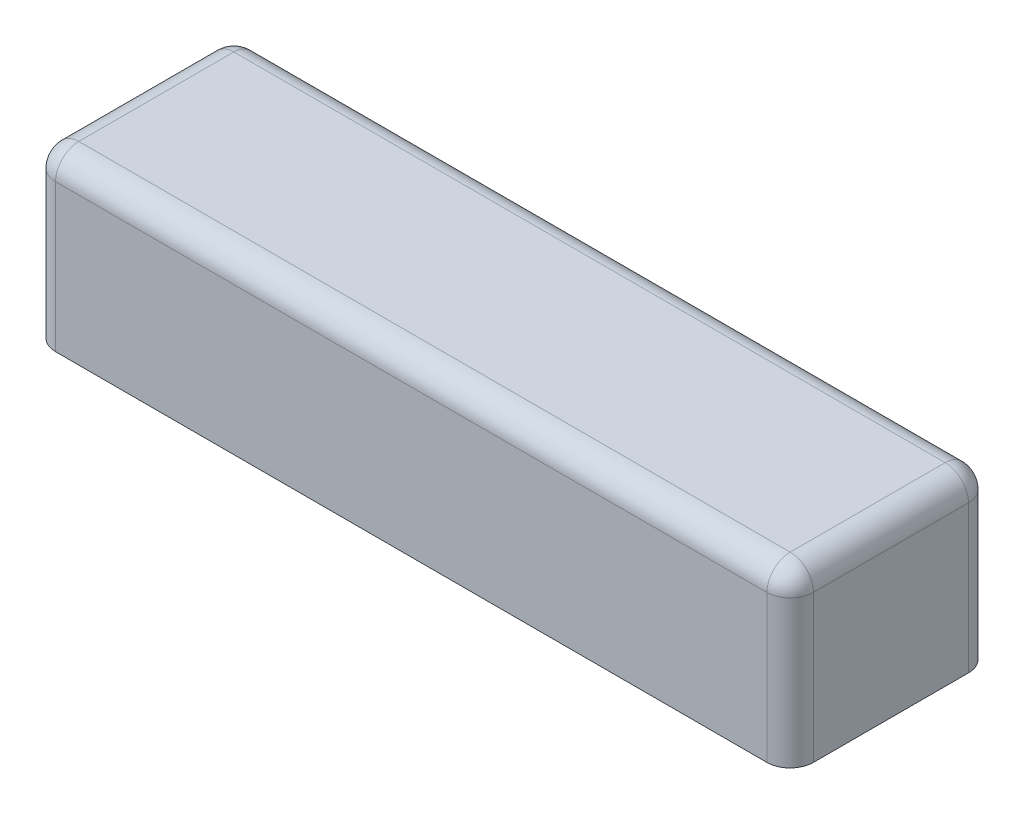
ISO-10303-21;
HEADER;
FILE_DESCRIPTION(('STEP AP214'),'2;1');
FILE_NAME('part.step','',(''),(''),'','','');
FILE_SCHEMA(('AUTOMOTIVE_DESIGN { 1 0 10303 214 1 1 1 1 }'));
ENDSEC;
DATA;
#1=APPLICATION_CONTEXT('core data for automotive mechanical design processes');
#2=APPLICATION_PROTOCOL_DEFINITION('international standard','automotive_design',2000,#1);
#3=PRODUCT_CONTEXT('',#1,'mechanical');
#4=PRODUCT('Part','Part','',(#3));
#5=PRODUCT_RELATED_PRODUCT_CATEGORY('part','',(#4));
#6=PRODUCT_DEFINITION_FORMATION('','',#4);
#7=PRODUCT_DEFINITION_CONTEXT('part definition',#1,'design');
#8=PRODUCT_DEFINITION('design','',#6,#7);
#9=PRODUCT_DEFINITION_SHAPE('','',#8);
#10=(LENGTH_UNIT() NAMED_UNIT(*) SI_UNIT(.MILLI.,.METRE.));
#11=(NAMED_UNIT(*) PLANE_ANGLE_UNIT() SI_UNIT($,.RADIAN.));
#12=(NAMED_UNIT(*) SI_UNIT($,.STERADIAN.) SOLID_ANGLE_UNIT());
#13=UNCERTAINTY_MEASURE_WITH_UNIT(LENGTH_MEASURE(1.E-05),#10,'distance_accuracy_value','');
#14=(GEOMETRIC_REPRESENTATION_CONTEXT(3) GLOBAL_UNCERTAINTY_ASSIGNED_CONTEXT((#13)) GLOBAL_UNIT_ASSIGNED_CONTEXT((#10,
#11,#12)) REPRESENTATION_CONTEXT('',''));
#15=CARTESIAN_POINT('',(0.,0.,0.));
#16=DIRECTION('',(0.,0.,1.));
#17=DIRECTION('',(1.,0.,0.));
#18=AXIS2_PLACEMENT_3D('',#15,#16,#17);
#19=CARTESIAN_POINT('',(0.,5.2,0.));
#20=DIRECTION('',(0.,1.,0.));
#21=DIRECTION('',(0.,0.,1.));
#22=AXIS2_PLACEMENT_3D('',#19,#20,#21);
#23=PLANE('',#22);
#24=DIRECTION('',(1.,0.,0.));
#25=VECTOR('',#24,1.);
#26=CARTESIAN_POINT('',(0.,5.2,-12.));
#27=LINE('',#26,#25);
#28=CARTESIAN_POINT('',(-21.643,5.2,-12.));
#29=VERTEX_POINT('',#28);
#30=CARTESIAN_POINT('',(21.643,5.2,-12.));
#31=VERTEX_POINT('',#30);
#32=EDGE_CURVE('E310',#29,#31,#27,.T.);
#33=ORIENTED_EDGE('',*,*,#32,.T.);
#34=CARTESIAN_POINT('',(30.643,5.2,0.));
#35=DIRECTION('',(0.,1.,0.));
#36=DIRECTION('',(0.,0.,1.));
#37=AXIS2_PLACEMENT_3D('',#34,#35,#36);
#38=CIRCLE('',#37,15.);
#39=CARTESIAN_POINT('',(21.643,5.2,12.));
#40=VERTEX_POINT('',#39);
#41=EDGE_CURVE('E458',#31,#40,#38,.T.);
#42=ORIENTED_EDGE('',*,*,#41,.T.);
#43=DIRECTION('',(1.,0.,0.));
#44=VECTOR('',#43,1.);
#45=CARTESIAN_POINT('',(0.,5.2,12.));
#46=LINE('',#45,#44);
#47=CARTESIAN_POINT('',(-21.643,5.2,12.));
#48=VERTEX_POINT('',#47);
#49=EDGE_CURVE('E332',#48,#40,#46,.T.);
#50=ORIENTED_EDGE('',*,*,#49,.F.);
#51=CARTESIAN_POINT('',(-30.643,5.2,0.));
#52=DIRECTION('',(0.,1.,0.));
#53=DIRECTION('',(0.,0.,1.));
#54=AXIS2_PLACEMENT_3D('',#51,#52,#53);
#55=CIRCLE('',#54,15.);
#56=EDGE_CURVE('E456',#48,#29,#55,.T.);
#57=ORIENTED_EDGE('',*,*,#56,.T.);
#58=EDGE_LOOP('',(#33,#42,#50,#57));
#59=FACE_BOUND('',#58,.T.);
#60=ADVANCED_FACE('F125',(#59),#23,.F.);
#61=CARTESIAN_POINT('',(0.,0.,0.));
#62=DIRECTION('',(0.,1.,0.));
#63=DIRECTION('',(0.,0.,1.));
#64=AXIS2_PLACEMENT_3D('',#61,#62,#63);
#65=PLANE('',#64);
#66=DIRECTION('',(0.,0.,1.));
#67=VECTOR('',#66,1.);
#68=CARTESIAN_POINT('',(-48.893,0.,0.));
#69=LINE('',#68,#67);
#70=CARTESIAN_POINT('',(-48.893,0.,-10.));
#71=VERTEX_POINT('',#70);
#72=CARTESIAN_POINT('',(-48.893,0.,9.99999999999999));
#73=VERTEX_POINT('',#72);
#74=EDGE_CURVE('E335',#71,#73,#69,.T.);
#75=ORIENTED_EDGE('',*,*,#74,.F.);
#76=CARTESIAN_POINT('',(-45.893,0.,-10.));
#77=DIRECTION('',(0.,1.,0.));
#78=DIRECTION('',(0.,0.,1.));
#79=AXIS2_PLACEMENT_3D('',#76,#77,#78);
#80=CIRCLE('',#79,3.);
#81=CARTESIAN_POINT('',(-45.893,0.,-13.));
#82=VERTEX_POINT('',#81);
#83=EDGE_CURVE('E381',#71,#82,#80,.F.);
#84=ORIENTED_EDGE('',*,*,#83,.T.);
#85=DIRECTION('',(1.,0.,0.));
#86=VECTOR('',#85,1.);
#87=CARTESIAN_POINT('',(0.,0.,-13.));
#88=LINE('',#87,#86);
#89=CARTESIAN_POINT('',(45.893,0.,-13.));
#90=VERTEX_POINT('',#89);
#91=EDGE_CURVE('E331',#82,#90,#88,.T.);
#92=ORIENTED_EDGE('',*,*,#91,.T.);
#93=CARTESIAN_POINT('',(45.893,0.,-10.));
#94=DIRECTION('',(0.,1.,0.));
#95=DIRECTION('',(0.,0.,1.));
#96=AXIS2_PLACEMENT_3D('',#93,#94,#95);
#97=CIRCLE('',#96,3.);
#98=CARTESIAN_POINT('',(48.893,0.,-10.));
#99=VERTEX_POINT('',#98);
#100=EDGE_CURVE('E379',#90,#99,#97,.F.);
#101=ORIENTED_EDGE('',*,*,#100,.T.);
#102=DIRECTION('',(0.,0.,1.));
#103=VECTOR('',#102,1.);
#104=CARTESIAN_POINT('',(48.893,0.,0.));
#105=LINE('',#104,#103);
#106=CARTESIAN_POINT('',(48.893,0.,9.99999999999999));
#107=VERTEX_POINT('',#106);
#108=EDGE_CURVE('E328',#99,#107,#105,.T.);
#109=ORIENTED_EDGE('',*,*,#108,.T.);
#110=CARTESIAN_POINT('',(45.893,0.,9.99999999999999));
#111=DIRECTION('',(0.,1.,0.));
#112=DIRECTION('',(0.,0.,1.));
#113=AXIS2_PLACEMENT_3D('',#110,#111,#112);
#114=CIRCLE('',#113,3.);
#115=CARTESIAN_POINT('',(45.893,0.,13.));
#116=VERTEX_POINT('',#115);
#117=EDGE_CURVE('E375',#107,#116,#114,.F.);
#118=ORIENTED_EDGE('',*,*,#117,.T.);
#119=DIRECTION('',(1.,0.,0.));
#120=VECTOR('',#119,1.);
#121=CARTESIAN_POINT('',(0.,0.,13.));
#122=LINE('',#121,#120);
#123=CARTESIAN_POINT('',(-45.893,0.,13.));
#124=VERTEX_POINT('',#123);
#125=EDGE_CURVE('E338',#124,#116,#122,.T.);
#126=ORIENTED_EDGE('',*,*,#125,.F.);
#127=CARTESIAN_POINT('',(-45.893,0.,9.99999999999999));
#128=DIRECTION('',(0.,1.,0.));
#129=DIRECTION('',(0.,0.,1.));
#130=AXIS2_PLACEMENT_3D('',#127,#128,#129);
#131=CIRCLE('',#130,3.);
#132=EDGE_CURVE('E377',#124,#73,#131,.F.);
#133=ORIENTED_EDGE('',*,*,#132,.T.);
#134=EDGE_LOOP('',(#75,#84,#92,#101,#109,#118,#126,#133));
#135=FACE_BOUND('',#134,.T.);
#136=DIRECTION('',(0.,0.,1.));
#137=VECTOR('',#136,1.);
#138=CARTESIAN_POINT('',(-45.393,0.,-12.));
#139=LINE('',#138,#137);
#140=CARTESIAN_POINT('',(-45.393,0.,-12.));
#141=VERTEX_POINT('',#140);
#142=CARTESIAN_POINT('',(-45.393,0.,12.));
#143=VERTEX_POINT('',#142);
#144=EDGE_CURVE('E309',#141,#143,#139,.T.);
#145=ORIENTED_EDGE('',*,*,#144,.T.);
#146=DIRECTION('',(1.,0.,0.));
#147=VECTOR('',#146,1.);
#148=CARTESIAN_POINT('',(0.,0.,12.));
#149=LINE('',#148,#147);
#150=CARTESIAN_POINT('',(45.393,0.,12.));
#151=VERTEX_POINT('',#150);
#152=EDGE_CURVE('E294',#143,#151,#149,.T.);
#153=ORIENTED_EDGE('',*,*,#152,.T.);
#154=DIRECTION('',(0.,0.,1.));
#155=VECTOR('',#154,1.);
#156=CARTESIAN_POINT('',(45.393,0.,-12.));
#157=LINE('',#156,#155);
#158=CARTESIAN_POINT('',(45.393,0.,-12.));
#159=VERTEX_POINT('',#158);
#160=EDGE_CURVE('E307',#159,#151,#157,.T.);
#161=ORIENTED_EDGE('',*,*,#160,.F.);
#162=DIRECTION('',(1.,0.,0.));
#163=VECTOR('',#162,1.);
#164=CARTESIAN_POINT('',(0.,0.,-12.));
#165=LINE('',#164,#163);
#166=EDGE_CURVE('E300',#141,#159,#165,.T.);
#167=ORIENTED_EDGE('',*,*,#166,.F.);
#168=EDGE_LOOP('',(#145,#153,#161,#167));
#169=FACE_BOUND('',#168,.T.);
#170=ADVANCED_FACE('F305',(#135,#169),#65,.F.);
#171=CARTESIAN_POINT('',(48.893,22.,0.));
#172=DIRECTION('',(1.,0.,0.));
#173=DIRECTION('',(0.,0.,-1.));
#174=AXIS2_PLACEMENT_3D('',#171,#172,#173);
#175=PLANE('',#174);
#176=ORIENTED_EDGE('',*,*,#108,.F.);
#177=DIRECTION('',(0.,-1.,0.));
#178=VECTOR('',#177,1.);
#179=CARTESIAN_POINT('',(48.893,22.,-10.));
#180=LINE('',#179,#178);
#181=CARTESIAN_POINT('',(48.893,19.,-10.));
#182=VERTEX_POINT('',#181);
#183=EDGE_CURVE('E373',#99,#182,#180,.F.);
#184=ORIENTED_EDGE('',*,*,#183,.T.);
#185=DIRECTION('',(0.,0.,1.));
#186=VECTOR('',#185,1.);
#187=CARTESIAN_POINT('',(48.893,19.,0.));
#188=LINE('',#187,#186);
#189=CARTESIAN_POINT('',(48.893,19.,9.99999999999999));
#190=VERTEX_POINT('',#189);
#191=EDGE_CURVE('E371',#182,#190,#188,.T.);
#192=ORIENTED_EDGE('',*,*,#191,.T.);
#193=DIRECTION('',(0.,-1.,0.));
#194=VECTOR('',#193,1.);
#195=CARTESIAN_POINT('',(48.893,0.,9.99999999999999));
#196=LINE('',#195,#194);
#197=EDGE_CURVE('E369',#190,#107,#196,.T.);
#198=ORIENTED_EDGE('',*,*,#197,.T.);
#199=EDGE_LOOP('',(#176,#184,#192,#198));
#200=FACE_BOUND('',#199,.T.);
#201=ADVANCED_FACE('F550',(#200),#175,.T.);
#202=CARTESIAN_POINT('',(0.,22.,-13.));
#203=DIRECTION('',(0.,0.,-1.));
#204=DIRECTION('',(-1.,0.,0.));
#205=AXIS2_PLACEMENT_3D('',#202,#203,#204);
#206=PLANE('',#205);
#207=ORIENTED_EDGE('',*,*,#91,.F.);
#208=DIRECTION('',(0.,-1.,0.));
#209=VECTOR('',#208,1.);
#210=CARTESIAN_POINT('',(-45.893,22.,-13.));
#211=LINE('',#210,#209);
#212=CARTESIAN_POINT('',(-45.893,19.,-13.));
#213=VERTEX_POINT('',#212);
#214=EDGE_CURVE('E367',#82,#213,#211,.F.);
#215=ORIENTED_EDGE('',*,*,#214,.T.);
#216=DIRECTION('',(1.,0.,0.));
#217=VECTOR('',#216,1.);
#218=CARTESIAN_POINT('',(0.,19.,-13.));
#219=LINE('',#218,#217);
#220=CARTESIAN_POINT('',(45.893,19.,-13.));
#221=VERTEX_POINT('',#220);
#222=EDGE_CURVE('E365',#213,#221,#219,.T.);
#223=ORIENTED_EDGE('',*,*,#222,.T.);
#224=DIRECTION('',(0.,-1.,0.));
#225=VECTOR('',#224,1.);
#226=CARTESIAN_POINT('',(45.893,22.,-13.));
#227=LINE('',#226,#225);
#228=EDGE_CURVE('E363',#221,#90,#227,.T.);
#229=ORIENTED_EDGE('',*,*,#228,.T.);
#230=EDGE_LOOP('',(#207,#215,#223,#229));
#231=FACE_BOUND('',#230,.T.);
#232=ADVANCED_FACE('F854',(#231),#206,.T.);
#233=CARTESIAN_POINT('',(-48.893,22.,0.));
#234=DIRECTION('',(1.,0.,0.));
#235=DIRECTION('',(0.,0.,-1.));
#236=AXIS2_PLACEMENT_3D('',#233,#234,#235);
#237=PLANE('',#236);
#238=DIRECTION('',(0.,0.,1.));
#239=VECTOR('',#238,1.);
#240=CARTESIAN_POINT('',(-48.893,19.,-13.));
#241=LINE('',#240,#239);
#242=CARTESIAN_POINT('',(-48.893,19.,9.99999999999999));
#243=VERTEX_POINT('',#242);
#244=CARTESIAN_POINT('',(-48.893,19.,-10.));
#245=VERTEX_POINT('',#244);
#246=EDGE_CURVE('E359',#243,#245,#241,.F.);
#247=ORIENTED_EDGE('',*,*,#246,.T.);
#248=DIRECTION('',(0.,-1.,0.));
#249=VECTOR('',#248,1.);
#250=CARTESIAN_POINT('',(-48.893,0.,-10.));
#251=LINE('',#250,#249);
#252=EDGE_CURVE('E361',#245,#71,#251,.T.);
#253=ORIENTED_EDGE('',*,*,#252,.T.);
#254=ORIENTED_EDGE('',*,*,#74,.T.);
#255=DIRECTION('',(0.,-1.,0.));
#256=VECTOR('',#255,1.);
#257=CARTESIAN_POINT('',(-48.893,22.,9.99999999999999));
#258=LINE('',#257,#256);
#259=EDGE_CURVE('E357',#73,#243,#258,.F.);
#260=ORIENTED_EDGE('',*,*,#259,.T.);
#261=EDGE_LOOP('',(#247,#253,#254,#260));
#262=FACE_BOUND('',#261,.T.);
#263=ADVANCED_FACE('F858',(#262),#237,.F.);
#264=CARTESIAN_POINT('',(0.,22.,13.));
#265=DIRECTION('',(0.,0.,-1.));
#266=DIRECTION('',(-1.,0.,0.));
#267=AXIS2_PLACEMENT_3D('',#264,#265,#266);
#268=PLANE('',#267);
#269=DIRECTION('',(1.,0.,0.));
#270=VECTOR('',#269,1.);
#271=CARTESIAN_POINT('',(-48.893,19.,13.));
#272=LINE('',#271,#270);
#273=CARTESIAN_POINT('',(45.893,19.,13.));
#274=VERTEX_POINT('',#273);
#275=CARTESIAN_POINT('',(-45.893,19.,13.));
#276=VERTEX_POINT('',#275);
#277=EDGE_CURVE('E352',#274,#276,#272,.F.);
#278=ORIENTED_EDGE('',*,*,#277,.T.);
#279=DIRECTION('',(0.,-1.,0.));
#280=VECTOR('',#279,1.);
#281=CARTESIAN_POINT('',(-45.893,22.,13.));
#282=LINE('',#281,#280);
#283=EDGE_CURVE('E355',#276,#124,#282,.T.);
#284=ORIENTED_EDGE('',*,*,#283,.T.);
#285=ORIENTED_EDGE('',*,*,#125,.T.);
#286=DIRECTION('',(0.,-1.,0.));
#287=VECTOR('',#286,1.);
#288=CARTESIAN_POINT('',(45.893,22.,13.));
#289=LINE('',#288,#287);
#290=EDGE_CURVE('E350',#116,#274,#289,.F.);
#291=ORIENTED_EDGE('',*,*,#290,.T.);
#292=EDGE_LOOP('',(#278,#284,#285,#291));
#293=FACE_BOUND('',#292,.T.);
#294=ADVANCED_FACE('F862',(#293),#268,.F.);
#295=CARTESIAN_POINT('',(0.,22.,0.));
#296=DIRECTION('',(0.,1.,0.));
#297=DIRECTION('',(0.,0.,1.));
#298=AXIS2_PLACEMENT_3D('',#295,#296,#297);
#299=PLANE('',#298);
#300=DIRECTION('',(0.,0.,1.));
#301=VECTOR('',#300,1.);
#302=CARTESIAN_POINT('',(-45.893,22.,13.));
#303=LINE('',#302,#301);
#304=CARTESIAN_POINT('',(-45.893,22.,-10.));
#305=VERTEX_POINT('',#304);
#306=CARTESIAN_POINT('',(-45.893,22.,9.99999999999999));
#307=VERTEX_POINT('',#306);
#308=EDGE_CURVE('E345',#305,#307,#303,.T.);
#309=ORIENTED_EDGE('',*,*,#308,.T.);
#310=DIRECTION('',(1.,0.,0.));
#311=VECTOR('',#310,1.);
#312=CARTESIAN_POINT('',(48.893,22.,9.99999999999999));
#313=LINE('',#312,#311);
#314=CARTESIAN_POINT('',(45.893,22.,9.99999999999999));
#315=VERTEX_POINT('',#314);
#316=EDGE_CURVE('E347',#307,#315,#313,.T.);
#317=ORIENTED_EDGE('',*,*,#316,.T.);
#318=DIRECTION('',(0.,0.,1.));
#319=VECTOR('',#318,1.);
#320=CARTESIAN_POINT('',(45.893,22.,0.));
#321=LINE('',#320,#319);
#322=CARTESIAN_POINT('',(45.893,22.,-10.));
#323=VERTEX_POINT('',#322);
#324=EDGE_CURVE('E341',#315,#323,#321,.F.);
#325=ORIENTED_EDGE('',*,*,#324,.T.);
#326=DIRECTION('',(1.,0.,0.));
#327=VECTOR('',#326,1.);
#328=CARTESIAN_POINT('',(0.,22.,-10.));
#329=LINE('',#328,#327);
#330=EDGE_CURVE('E343',#323,#305,#329,.F.);
#331=ORIENTED_EDGE('',*,*,#330,.T.);
#332=EDGE_LOOP('',(#309,#317,#325,#331));
#333=FACE_BOUND('',#332,.T.);
#334=ADVANCED_FACE('F481',(#333),#299,.T.);
#335=CARTESIAN_POINT('',(0.,5.2,-12.));
#336=DIRECTION('',(0.,0.,-1.));
#337=DIRECTION('',(-1.,0.,0.));
#338=AXIS2_PLACEMENT_3D('',#335,#336,#337);
#339=PLANE('',#338);
#340=DIRECTION('',(0.,-1.,0.));
#341=VECTOR('',#340,1.);
#342=CARTESIAN_POINT('',(45.393,5.2,-12.));
#343=LINE('',#342,#341);
#344=CARTESIAN_POINT('',(45.393,14.,-12.));
#345=VERTEX_POINT('',#344);
#346=EDGE_CURVE('E301',#345,#159,#343,.T.);
#347=ORIENTED_EDGE('',*,*,#346,.F.);
#348=DIRECTION('',(1.,0.,0.));
#349=VECTOR('',#348,1.);
#350=CARTESIAN_POINT('',(30.643,14.,-12.));
#351=LINE('',#350,#349);
#352=CARTESIAN_POINT('',(30.643,14.,-12.));
#353=VERTEX_POINT('',#352);
#354=EDGE_CURVE('E435',#345,#353,#351,.F.);
#355=ORIENTED_EDGE('',*,*,#354,.T.);
#356=DIRECTION('',(0.,-1.,0.));
#357=VECTOR('',#356,1.);
#358=CARTESIAN_POINT('',(30.643,17.,-12.));
#359=LINE('',#358,#357);
#360=CARTESIAN_POINT('',(30.643,8.2,-12.));
#361=VERTEX_POINT('',#360);
#362=EDGE_CURVE('E419',#353,#361,#359,.T.);
#363=ORIENTED_EDGE('',*,*,#362,.T.);
#364=CARTESIAN_POINT('',(21.643,5.2,-12.));
#365=CARTESIAN_POINT('',(21.8020766923954,5.20001489904946,-12.));
#366=CARTESIAN_POINT('',(21.961105762087,5.20455394230476,-12.));
#367=CARTESIAN_POINT('',(22.2786318177453,5.22185759578652,-12.));
#368=CARTESIAN_POINT('',(22.4371290551688,5.2346175197705,-12.));
#369=CARTESIAN_POINT('',(22.7528717005782,5.26749368861974,-12.));
#370=CARTESIAN_POINT('',(22.9101194190999,5.28758819225895,-12.));
#371=CARTESIAN_POINT('',(23.2236327988538,5.33442956710065,-12.));
#372=CARTESIAN_POINT('',(23.3798983026744,5.36117747805649,-12.));
#373=CARTESIAN_POINT('',(23.8428747061777,5.44962530053576,-12.));
#374=CARTESIAN_POINT('',(24.1479464909969,5.52000142387838,-12.));
#375=CARTESIAN_POINT('',(24.7532233899264,5.67974739194473,-12.));
#376=CARTESIAN_POINT('',(25.0534240846647,5.76913354863459,-12.));
#377=CARTESIAN_POINT('',(25.8071572973628,6.01475239292984,-12.));
#378=CARTESIAN_POINT('',(26.2573254092432,6.1812536117806,-12.));
#379=CARTESIAN_POINT('',(27.1475385589014,6.53896542830783,-12.));
#380=CARTESIAN_POINT('',(27.5875822281613,6.73017934354466,-12.));
#381=CARTESIAN_POINT('',(28.9003020269432,7.32868208321095,-12.));
#382=CARTESIAN_POINT('',(29.762030186972,7.75951532038705,-11.9999999999998));
#383=CARTESIAN_POINT('',(30.6299360686596,8.19346804905422,-12.));
#384=CARTESIAN_POINT('',(30.6364680414188,8.19673403559844,-12.));
#385=CARTESIAN_POINT('',(30.643,8.2,-12.));
#386=B_SPLINE_CURVE_WITH_KNOTS('',3,(#364,#365,#366,#367,#368,#369,#370,#371,#372,#373,#374,
#375,#376,#377,#378,#379,#380,#381,#382,#383,#384,#385),.UNSPECIFIED.,.F.,.F.,(4,2,2,2,2,2,2,2,
2,2,4),(0.,0.477096880893854,0.95392203714818,1.42934511243079,1.90484253061925,
2.84325071514363,3.78246739336723,5.2211942404823,6.66011443075201,9.54924122393067,
9.57115012623225),.UNSPECIFIED.);
#387=EDGE_CURVE('E460',#361,#31,#386,.F.);
#388=ORIENTED_EDGE('',*,*,#387,.T.);
#389=ORIENTED_EDGE('',*,*,#32,.F.);
#390=CARTESIAN_POINT('',(-21.643,5.2,-12.));
#391=CARTESIAN_POINT('',(-21.8020766923947,5.20001489904946,-12.));
#392=CARTESIAN_POINT('',(-21.9611057620855,5.20455394230471,-12.));
#393=CARTESIAN_POINT('',(-22.2786318177422,5.2218575957863,-12.));
#394=CARTESIAN_POINT('',(-22.437129055165,5.23461751977016,-12.));
#395=CARTESIAN_POINT('',(-22.7528717005729,5.26749368861911,-12.));
#396=CARTESIAN_POINT('',(-22.9101194190941,5.28758819225816,-12.));
#397=CARTESIAN_POINT('',(-23.2236327988467,5.3344295670995,-12.));
#398=CARTESIAN_POINT('',(-23.3798983026667,5.36117747805514,-12.));
#399=CARTESIAN_POINT('',(-23.842874706171,5.44962530053424,-12.));
#400=CARTESIAN_POINT('',(-24.1479464909917,5.52000142387703,-12.));
#401=CARTESIAN_POINT('',(-24.7532233899239,5.67974739194403,-12.));
#402=CARTESIAN_POINT('',(-25.0534240846635,5.76913354863438,-12.));
#403=CARTESIAN_POINT('',(-25.8071572973632,6.01475239292963,-12.));
#404=CARTESIAN_POINT('',(-26.2573254092443,6.18125361177944,-12.));
#405=CARTESIAN_POINT('',(-27.147538558902,6.53896542830963,-12.));
#406=CARTESIAN_POINT('',(-27.5875822281606,6.73017934355038,-12.));
#407=CARTESIAN_POINT('',(-28.9003020269498,7.32868208320174,-12.));
#408=CARTESIAN_POINT('',(-29.7620301870002,7.75951532033278,-12.));
#409=CARTESIAN_POINT('',(-30.6299360686601,8.19346804905341,-12.));
#410=CARTESIAN_POINT('',(-30.6364680414191,8.19673403559803,-12.));
#411=CARTESIAN_POINT('',(-30.643,8.2,-12.));
#412=B_SPLINE_CURVE_WITH_KNOTS('',3,(#390,#391,#392,#393,#394,#395,#396,#397,#398,#399,#400,
#401,#402,#403,#404,#405,#406,#407,#408,#409,#410,#411),.UNSPECIFIED.,.F.,.F.,(4,2,2,2,2,2,2,2,
2,2,4),(0.,0.4770968808915,0.953922037143465,1.42934511242422,1.90484253061084,2.84325071513972,
3.78246739336724,5.22119424048296,6.66011443075452,9.54924122393073,9.57115012623225),.UNSPECIFIED.);
#413=CARTESIAN_POINT('',(-30.643,8.2,-12.));
#414=VERTEX_POINT('',#413);
#415=EDGE_CURVE('E12',#29,#414,#412,.T.);
#416=ORIENTED_EDGE('',*,*,#415,.T.);
#417=DIRECTION('',(0.,-1.,0.));
#418=VECTOR('',#417,1.);
#419=CARTESIAN_POINT('',(-30.643,17.,-12.));
#420=LINE('',#419,#418);
#421=CARTESIAN_POINT('',(-30.643,14.,-12.));
#422=VERTEX_POINT('',#421);
#423=EDGE_CURVE('E320',#422,#414,#420,.T.);
#424=ORIENTED_EDGE('',*,*,#423,.F.);
#425=DIRECTION('',(1.,0.,0.));
#426=VECTOR('',#425,1.);
#427=CARTESIAN_POINT('',(-45.393,14.,-12.));
#428=LINE('',#427,#426);
#429=CARTESIAN_POINT('',(-45.393,14.,-12.));
#430=VERTEX_POINT('',#429);
#431=EDGE_CURVE('E433',#422,#430,#428,.F.);
#432=ORIENTED_EDGE('',*,*,#431,.T.);
#433=DIRECTION('',(0.,-1.,0.));
#434=VECTOR('',#433,1.);
#435=CARTESIAN_POINT('',(-45.393,5.2,-12.));
#436=LINE('',#435,#434);
#437=EDGE_CURVE('E325',#430,#141,#436,.T.);
#438=ORIENTED_EDGE('',*,*,#437,.T.);
#439=ORIENTED_EDGE('',*,*,#166,.T.);
#440=EDGE_LOOP('',(#347,#355,#363,#388,#389,#416,#424,#432,#438,#439));
#441=FACE_BOUND('',#440,.T.);
#442=ADVANCED_FACE('F477',(#441),#339,.F.);
#443=CARTESIAN_POINT('',(0.,5.2,12.));
#444=DIRECTION('',(0.,0.,-1.));
#445=DIRECTION('',(-1.,0.,0.));
#446=AXIS2_PLACEMENT_3D('',#443,#444,#445);
#447=PLANE('',#446);
#448=DIRECTION('',(0.,-1.,0.));
#449=VECTOR('',#448,1.);
#450=CARTESIAN_POINT('',(30.643,17.,12.));
#451=LINE('',#450,#449);
#452=CARTESIAN_POINT('',(30.643,14.,12.));
#453=VERTEX_POINT('',#452);
#454=CARTESIAN_POINT('',(30.643,8.2,12.));
#455=VERTEX_POINT('',#454);
#456=EDGE_CURVE('E585',#453,#455,#451,.T.);
#457=ORIENTED_EDGE('',*,*,#456,.F.);
#458=DIRECTION('',(1.,0.,0.));
#459=VECTOR('',#458,1.);
#460=CARTESIAN_POINT('',(0.,14.,12.));
#461=LINE('',#460,#459);
#462=CARTESIAN_POINT('',(45.393,14.,12.));
#463=VERTEX_POINT('',#462);
#464=EDGE_CURVE('E297',#453,#463,#461,.T.);
#465=ORIENTED_EDGE('',*,*,#464,.T.);
#466=DIRECTION('',(0.,-1.,0.));
#467=VECTOR('',#466,1.);
#468=CARTESIAN_POINT('',(45.393,5.2,12.));
#469=LINE('',#468,#467);
#470=EDGE_CURVE('E289',#463,#151,#469,.T.);
#471=ORIENTED_EDGE('',*,*,#470,.T.);
#472=ORIENTED_EDGE('',*,*,#152,.F.);
#473=DIRECTION('',(0.,-1.,0.));
#474=VECTOR('',#473,1.);
#475=CARTESIAN_POINT('',(-45.393,5.2,12.));
#476=LINE('',#475,#474);
#477=CARTESIAN_POINT('',(-45.393,14.,12.));
#478=VERTEX_POINT('',#477);
#479=EDGE_CURVE('E317',#478,#143,#476,.T.);
#480=ORIENTED_EDGE('',*,*,#479,.F.);
#481=DIRECTION('',(1.,0.,0.));
#482=VECTOR('',#481,1.);
#483=CARTESIAN_POINT('',(0.,14.,12.));
#484=LINE('',#483,#482);
#485=CARTESIAN_POINT('',(-30.643,14.,12.));
#486=VERTEX_POINT('',#485);
#487=EDGE_CURVE('E383',#478,#486,#484,.T.);
#488=ORIENTED_EDGE('',*,*,#487,.T.);
#489=DIRECTION('',(0.,-1.,0.));
#490=VECTOR('',#489,1.);
#491=CARTESIAN_POINT('',(-30.643,17.,12.));
#492=LINE('',#491,#490);
#493=CARTESIAN_POINT('',(-30.643,8.2,12.));
#494=VERTEX_POINT('',#493);
#495=EDGE_CURVE('E315',#486,#494,#492,.T.);
#496=ORIENTED_EDGE('',*,*,#495,.T.);
#497=CARTESIAN_POINT('',(-21.643,5.2,12.));
#498=CARTESIAN_POINT('',(-21.8020766923952,5.20001489904946,12.));
#499=CARTESIAN_POINT('',(-21.9611057620866,5.20455394230474,12.));
#500=CARTESIAN_POINT('',(-22.2786318177443,5.22185759578645,12.));
#501=CARTESIAN_POINT('',(-22.4371290551676,5.23461751977038,12.));
#502=CARTESIAN_POINT('',(-22.7528717005765,5.26749368861953,12.));
#503=CARTESIAN_POINT('',(-22.9101194190981,5.28758819225869,12.));
#504=CARTESIAN_POINT('',(-23.2236327988515,5.33442956710027,12.));
#505=CARTESIAN_POINT('',(-23.3798983026719,5.36117747805605,12.));
#506=CARTESIAN_POINT('',(-23.8428747061755,5.44962530053526,12.));
#507=CARTESIAN_POINT('',(-24.1479464909952,5.52000142387794,12.));
#508=CARTESIAN_POINT('',(-24.7532233899256,5.6797473919445,12.));
#509=CARTESIAN_POINT('',(-25.0534240846643,5.76913354863452,12.));
#510=CARTESIAN_POINT('',(-25.8071572973629,6.01475239292977,12.));
#511=CARTESIAN_POINT('',(-26.2573254092436,6.18125361178022,12.));
#512=CARTESIAN_POINT('',(-27.1475385589016,6.53896542830841,12.));
#513=CARTESIAN_POINT('',(-27.5875822281611,6.73017934354653,12.));
#514=CARTESIAN_POINT('',(-28.9003020269454,7.3286820832079,12.));
#515=CARTESIAN_POINT('',(-29.7620301869813,7.75951532036917,11.9999999999998));
#516=CARTESIAN_POINT('',(-30.6299360686598,8.19346804905392,12.));
#517=CARTESIAN_POINT('',(-30.6364680414189,8.19673403559829,12.));
#518=CARTESIAN_POINT('',(-30.643,8.2,12.));
#519=B_SPLINE_CURVE_WITH_KNOTS('',3,(#497,#498,#499,#500,#501,#502,#503,#504,#505,#506,#507,
#508,#509,#510,#511,#512,#513,#514,#515,#516,#517,#518),.UNSPECIFIED.,.F.,.F.,(4,2,2,2,2,2,2,2,
2,2,4),(0.,0.47709688089308,0.953922037146628,1.42934511242863,1.90484253061648,
2.84325071514235,3.78246739336723,5.22119424048249,6.6601144307528,9.5492412239306,
9.57115012623225),.UNSPECIFIED.);
#520=EDGE_CURVE('E135',#494,#48,#519,.F.);
#521=ORIENTED_EDGE('',*,*,#520,.T.);
#522=ORIENTED_EDGE('',*,*,#49,.T.);
#523=CARTESIAN_POINT('',(21.643,5.2,12.));
#524=CARTESIAN_POINT('',(21.8020766923965,5.20001489904946,12.));
#525=CARTESIAN_POINT('',(21.9611057620892,5.20455394230482,12.));
#526=CARTESIAN_POINT('',(22.2786318177496,5.22185759578681,12.));
#527=CARTESIAN_POINT('',(22.4371290551743,5.23461751977096,12.));
#528=CARTESIAN_POINT('',(22.7528717005855,5.26749368862061,12.));
#529=CARTESIAN_POINT('',(22.9101194191081,5.28758819226005,12.));
#530=CARTESIAN_POINT('',(23.2236327988636,5.33442956710226,12.));
#531=CARTESIAN_POINT('',(23.379898302685,5.36117747805837,12.));
#532=CARTESIAN_POINT('',(23.8428747061871,5.44962530053787,12.));
#533=CARTESIAN_POINT('',(24.1479464910041,5.52000142388026,12.));
#534=CARTESIAN_POINT('',(24.7532233899299,5.6797473919457,12.));
#535=CARTESIAN_POINT('',(25.0534240846666,5.7691335486349,12.));
#536=CARTESIAN_POINT('',(25.8071572973623,6.01475239293014,12.));
#537=CARTESIAN_POINT('',(26.2573254092417,6.18125361178222,12.));
#538=CARTESIAN_POINT('',(27.1475385589007,6.53896542830535,12.));
#539=CARTESIAN_POINT('',(27.5875822281624,6.73017934353673,12.));
#540=CARTESIAN_POINT('',(28.9003020269342,7.32868208322379,11.9999999999999));
#541=CARTESIAN_POINT('',(29.762030186933,7.75951532046255,11.9999999999995));
#542=CARTESIAN_POINT('',(30.6299360686591,8.19346804905537,12.));
#543=CARTESIAN_POINT('',(30.6364680414185,8.19673403559902,12.));
#544=CARTESIAN_POINT('',(30.643,8.2,12.));
#545=B_SPLINE_CURVE_WITH_KNOTS('',3,(#523,#524,#525,#526,#527,#528,#529,#530,#531,#532,#533,
#534,#535,#536,#537,#538,#539,#540,#541,#542,#543,#544),.UNSPECIFIED.,.F.,.F.,(4,2,2,2,2,2,2,2,
2,2,4),(0.,0.477096880897133,0.953922037154739,1.42934511243992,1.90484253063095,
2.84325071514911,3.78246739336723,5.22119424048142,6.66011443074857,9.54924122393066,
9.57115012623223),.UNSPECIFIED.);
#546=EDGE_CURVE('E467',#40,#455,#545,.T.);
#547=ORIENTED_EDGE('',*,*,#546,.T.);
#548=EDGE_LOOP('',(#457,#465,#471,#472,#480,#488,#496,#521,#522,#547));
#549=FACE_BOUND('',#548,.T.);
#550=ADVANCED_FACE('F292',(#549),#447,.T.);
#551=CARTESIAN_POINT('',(-45.393,5.2,-12.));
#552=DIRECTION('',(1.,0.,0.));
#553=DIRECTION('',(0.,0.,-1.));
#554=AXIS2_PLACEMENT_3D('',#551,#552,#553);
#555=PLANE('',#554);
#556=ORIENTED_EDGE('',*,*,#437,.F.);
#557=DIRECTION('',(0.,0.,1.));
#558=VECTOR('',#557,1.);
#559=CARTESIAN_POINT('',(-45.393,14.,-12.));
#560=LINE('',#559,#558);
#561=EDGE_CURVE('E454',#430,#478,#560,.T.);
#562=ORIENTED_EDGE('',*,*,#561,.T.);
#563=ORIENTED_EDGE('',*,*,#479,.T.);
#564=ORIENTED_EDGE('',*,*,#144,.F.);
#565=EDGE_LOOP('',(#556,#562,#563,#564));
#566=FACE_BOUND('',#565,.T.);
#567=ADVANCED_FACE('F483',(#566),#555,.T.);
#568=CARTESIAN_POINT('',(45.393,5.2,-12.));
#569=DIRECTION('',(1.,0.,0.));
#570=DIRECTION('',(0.,0.,-1.));
#571=AXIS2_PLACEMENT_3D('',#568,#569,#570);
#572=PLANE('',#571);
#573=ORIENTED_EDGE('',*,*,#470,.F.);
#574=DIRECTION('',(0.,0.,1.));
#575=VECTOR('',#574,1.);
#576=CARTESIAN_POINT('',(45.393,14.,-12.));
#577=LINE('',#576,#575);
#578=EDGE_CURVE('E431',#463,#345,#577,.F.);
#579=ORIENTED_EDGE('',*,*,#578,.T.);
#580=ORIENTED_EDGE('',*,*,#346,.T.);
#581=ORIENTED_EDGE('',*,*,#160,.T.);
#582=EDGE_LOOP('',(#573,#579,#580,#581));
#583=FACE_BOUND('',#582,.T.);
#584=ADVANCED_FACE('F312',(#583),#572,.F.);
#585=CARTESIAN_POINT('',(30.643,17.,0.));
#586=DIRECTION('',(0.,-1.,0.));
#587=DIRECTION('',(0.,0.,-1.));
#588=AXIS2_PLACEMENT_3D('',#585,#586,#587);
#589=CYLINDRICAL_SURFACE('',#588,12.);
#590=ORIENTED_EDGE('',*,*,#362,.F.);
#591=CARTESIAN_POINT('',(30.643,14.,0.));
#592=DIRECTION('',(0.,1.,0.));
#593=DIRECTION('',(0.,0.,1.));
#594=AXIS2_PLACEMENT_3D('',#591,#592,#593);
#595=CIRCLE('',#594,12.);
#596=EDGE_CURVE('E440',#353,#453,#595,.T.);
#597=ORIENTED_EDGE('',*,*,#596,.T.);
#598=ORIENTED_EDGE('',*,*,#456,.T.);
#599=CARTESIAN_POINT('',(30.643,8.2,0.));
#600=DIRECTION('',(0.,1.,0.));
#601=DIRECTION('',(0.,0.,1.));
#602=AXIS2_PLACEMENT_3D('',#599,#600,#601);
#603=CIRCLE('',#602,12.);
#604=EDGE_CURVE('E437',#455,#361,#603,.F.);
#605=ORIENTED_EDGE('',*,*,#604,.T.);
#606=EDGE_LOOP('',(#590,#597,#598,#605));
#607=FACE_BOUND('',#606,.T.);
#608=ADVANCED_FACE('F555',(#607),#589,.F.);
#609=CARTESIAN_POINT('',(0.,17.,0.));
#610=DIRECTION('',(0.,1.,0.));
#611=DIRECTION('',(0.,0.,1.));
#612=AXIS2_PLACEMENT_3D('',#609,#610,#611);
#613=PLANE('',#612);
#614=DIRECTION('',(0.,0.,1.));
#615=VECTOR('',#614,1.);
#616=CARTESIAN_POINT('',(42.393,17.,12.));
#617=LINE('',#616,#615);
#618=CARTESIAN_POINT('',(42.393,17.,-9.00000000000001));
#619=VERTEX_POINT('',#618);
#620=CARTESIAN_POINT('',(42.393,17.,9.));
#621=VERTEX_POINT('',#620);
#622=EDGE_CURVE('E426',#619,#621,#617,.T.);
#623=ORIENTED_EDGE('',*,*,#622,.T.);
#624=DIRECTION('',(1.,0.,0.));
#625=VECTOR('',#624,1.);
#626=CARTESIAN_POINT('',(0.,17.,9.));
#627=LINE('',#626,#625);
#628=CARTESIAN_POINT('',(30.643,17.,9.00000000000001));
#629=VERTEX_POINT('',#628);
#630=EDGE_CURVE('E428',#621,#629,#627,.F.);
#631=ORIENTED_EDGE('',*,*,#630,.T.);
#632=CARTESIAN_POINT('',(30.643,17.,0.));
#633=DIRECTION('',(0.,1.,0.));
#634=DIRECTION('',(0.,0.,1.));
#635=AXIS2_PLACEMENT_3D('',#632,#633,#634);
#636=CIRCLE('',#635,9.00000000000001);
#637=CARTESIAN_POINT('',(30.643,17.,-9.00000000000001));
#638=VERTEX_POINT('',#637);
#639=EDGE_CURVE('E422',#629,#638,#636,.F.);
#640=ORIENTED_EDGE('',*,*,#639,.T.);
#641=DIRECTION('',(1.,0.,0.));
#642=VECTOR('',#641,1.);
#643=CARTESIAN_POINT('',(45.393,17.,-9.00000000000001));
#644=LINE('',#643,#642);
#645=EDGE_CURVE('E424',#638,#619,#644,.T.);
#646=ORIENTED_EDGE('',*,*,#645,.T.);
#647=EDGE_LOOP('',(#623,#631,#640,#646));
#648=FACE_BOUND('',#647,.T.);
#649=ADVANCED_FACE('F541',(#648),#613,.F.);
#650=CARTESIAN_POINT('',(-30.643,17.,0.));
#651=DIRECTION('',(0.,-1.,0.));
#652=DIRECTION('',(0.,0.,-1.));
#653=AXIS2_PLACEMENT_3D('',#650,#651,#652);
#654=CYLINDRICAL_SURFACE('',#653,12.);
#655=ORIENTED_EDGE('',*,*,#495,.F.);
#656=CARTESIAN_POINT('',(-30.643,14.,0.));
#657=DIRECTION('',(0.,1.,0.));
#658=DIRECTION('',(0.,0.,1.));
#659=AXIS2_PLACEMENT_3D('',#656,#657,#658);
#660=CIRCLE('',#659,12.);
#661=EDGE_CURVE('E445',#486,#422,#660,.T.);
#662=ORIENTED_EDGE('',*,*,#661,.T.);
#663=ORIENTED_EDGE('',*,*,#423,.T.);
#664=CARTESIAN_POINT('',(-30.643,8.2,0.));
#665=DIRECTION('',(0.,1.,0.));
#666=DIRECTION('',(0.,0.,1.));
#667=AXIS2_PLACEMENT_3D('',#664,#665,#666);
#668=CIRCLE('',#667,12.);
#669=EDGE_CURVE('E442',#414,#494,#668,.F.);
#670=ORIENTED_EDGE('',*,*,#669,.T.);
#671=EDGE_LOOP('',(#655,#662,#663,#670));
#672=FACE_BOUND('',#671,.T.);
#673=ADVANCED_FACE('F531',(#672),#654,.F.);
#674=CARTESIAN_POINT('',(0.,17.,0.));
#675=DIRECTION('',(0.,1.,0.));
#676=DIRECTION('',(0.,0.,1.));
#677=AXIS2_PLACEMENT_3D('',#674,#675,#676);
#678=PLANE('',#677);
#679=DIRECTION('',(1.,0.,0.));
#680=VECTOR('',#679,1.);
#681=CARTESIAN_POINT('',(-30.643,17.,-9.00000000000001));
#682=LINE('',#681,#680);
#683=CARTESIAN_POINT('',(-42.393,17.,-9.00000000000001));
#684=VERTEX_POINT('',#683);
#685=CARTESIAN_POINT('',(-30.643,17.,-9.00000000000001));
#686=VERTEX_POINT('',#685);
#687=EDGE_CURVE('E143',#684,#686,#682,.T.);
#688=ORIENTED_EDGE('',*,*,#687,.T.);
#689=CARTESIAN_POINT('',(-30.643,17.,0.));
#690=DIRECTION('',(0.,1.,0.));
#691=DIRECTION('',(0.,0.,1.));
#692=AXIS2_PLACEMENT_3D('',#689,#690,#691);
#693=CIRCLE('',#692,9.);
#694=CARTESIAN_POINT('',(-30.643,17.,9.));
#695=VERTEX_POINT('',#694);
#696=EDGE_CURVE('E452',#686,#695,#693,.F.);
#697=ORIENTED_EDGE('',*,*,#696,.T.);
#698=DIRECTION('',(1.,0.,0.));
#699=VECTOR('',#698,1.);
#700=CARTESIAN_POINT('',(0.,17.,9.));
#701=LINE('',#700,#699);
#702=CARTESIAN_POINT('',(-42.393,17.,9.));
#703=VERTEX_POINT('',#702);
#704=EDGE_CURVE('E448',#695,#703,#701,.F.);
#705=ORIENTED_EDGE('',*,*,#704,.T.);
#706=DIRECTION('',(0.,0.,1.));
#707=VECTOR('',#706,1.);
#708=CARTESIAN_POINT('',(-42.393,17.,0.));
#709=LINE('',#708,#707);
#710=EDGE_CURVE('E148',#703,#684,#709,.F.);
#711=ORIENTED_EDGE('',*,*,#710,.T.);
#712=EDGE_LOOP('',(#688,#697,#705,#711));
#713=FACE_BOUND('',#712,.T.);
#714=ADVANCED_FACE('F528',(#713),#678,.F.);
#715=CARTESIAN_POINT('',(-45.893,22.,-10.));
#716=DIRECTION('',(0.,1.,0.));
#717=DIRECTION('',(0.,0.,1.));
#718=AXIS2_PLACEMENT_3D('',#715,#716,#717);
#719=CYLINDRICAL_SURFACE('',#718,3.);
#720=ORIENTED_EDGE('',*,*,#83,.F.);
#721=ORIENTED_EDGE('',*,*,#252,.F.);
#722=CARTESIAN_POINT('',(-45.893,19.,-10.));
#723=DIRECTION('',(0.,1.,0.));
#724=DIRECTION('',(0.,0.,1.));
#725=AXIS2_PLACEMENT_3D('',#722,#723,#724);
#726=CIRCLE('',#725,3.);
#727=EDGE_CURVE('E416',#213,#245,#726,.T.);
#728=ORIENTED_EDGE('',*,*,#727,.F.);
#729=ORIENTED_EDGE('',*,*,#214,.F.);
#730=EDGE_LOOP('',(#720,#721,#728,#729));
#731=FACE_BOUND('',#730,.T.);
#732=ADVANCED_FACE('F530',(#731),#719,.T.);
#733=CARTESIAN_POINT('',(0.,19.,-10.));
#734=DIRECTION('',(1.,0.,0.));
#735=DIRECTION('',(0.,0.,-1.));
#736=AXIS2_PLACEMENT_3D('',#733,#734,#735);
#737=CYLINDRICAL_SURFACE('',#736,3.);
#738=CARTESIAN_POINT('',(45.893,19.,-10.));
#739=DIRECTION('',(1.,0.,0.));
#740=DIRECTION('',(0.,0.,-1.));
#741=AXIS2_PLACEMENT_3D('',#738,#739,#740);
#742=CIRCLE('',#741,3.);
#743=EDGE_CURVE('E410',#221,#323,#742,.T.);
#744=ORIENTED_EDGE('',*,*,#743,.F.);
#745=ORIENTED_EDGE('',*,*,#222,.F.);
#746=CARTESIAN_POINT('',(-45.893,19.,-10.));
#747=DIRECTION('',(-1.,0.,0.));
#748=DIRECTION('',(0.,0.,1.));
#749=AXIS2_PLACEMENT_3D('',#746,#747,#748);
#750=CIRCLE('',#749,3.);
#751=EDGE_CURVE('E413',#305,#213,#750,.T.);
#752=ORIENTED_EDGE('',*,*,#751,.F.);
#753=ORIENTED_EDGE('',*,*,#330,.F.);
#754=EDGE_LOOP('',(#744,#745,#752,#753));
#755=FACE_BOUND('',#754,.T.);
#756=ADVANCED_FACE('F538',(#755),#737,.T.);
#757=CARTESIAN_POINT('',(45.893,22.,-10.));
#758=DIRECTION('',(0.,-1.,0.));
#759=DIRECTION('',(0.,0.,-1.));
#760=AXIS2_PLACEMENT_3D('',#757,#758,#759);
#761=CYLINDRICAL_SURFACE('',#760,3.);
#762=ORIENTED_EDGE('',*,*,#100,.F.);
#763=ORIENTED_EDGE('',*,*,#228,.F.);
#764=CARTESIAN_POINT('',(45.893,19.,-10.));
#765=DIRECTION('',(0.,1.,0.));
#766=DIRECTION('',(0.,0.,1.));
#767=AXIS2_PLACEMENT_3D('',#764,#765,#766);
#768=CIRCLE('',#767,3.);
#769=EDGE_CURVE('E407',#182,#221,#768,.T.);
#770=ORIENTED_EDGE('',*,*,#769,.F.);
#771=ORIENTED_EDGE('',*,*,#183,.F.);
#772=EDGE_LOOP('',(#762,#763,#770,#771));
#773=FACE_BOUND('',#772,.T.);
#774=ADVANCED_FACE('F683',(#773),#761,.T.);
#775=CARTESIAN_POINT('',(-45.893,19.,-10.));
#776=DIRECTION('',(0.,0.,-1.));
#777=DIRECTION('',(-1.,0.,0.));
#778=AXIS2_PLACEMENT_3D('',#775,#776,#777);
#779=SPHERICAL_SURFACE('',#778,3.);
#780=ORIENTED_EDGE('',*,*,#751,.T.);
#781=ORIENTED_EDGE('',*,*,#727,.T.);
#782=CARTESIAN_POINT('',(-45.893,19.,-10.));
#783=DIRECTION('',(0.,0.,-1.));
#784=DIRECTION('',(-1.,0.,0.));
#785=AXIS2_PLACEMENT_3D('',#782,#783,#784);
#786=CIRCLE('',#785,3.);
#787=EDGE_CURVE('E404',#305,#245,#786,.F.);
#788=ORIENTED_EDGE('',*,*,#787,.F.);
#789=EDGE_LOOP('',(#780,#781,#788));
#790=FACE_BOUND('',#789,.T.);
#791=ADVANCED_FACE('F692',(#790),#779,.T.);
#792=CARTESIAN_POINT('',(45.893,19.,-10.));
#793=DIRECTION('',(0.,0.,-1.));
#794=DIRECTION('',(-1.,0.,0.));
#795=AXIS2_PLACEMENT_3D('',#792,#793,#794);
#796=SPHERICAL_SURFACE('',#795,3.);
#797=ORIENTED_EDGE('',*,*,#769,.T.);
#798=ORIENTED_EDGE('',*,*,#743,.T.);
#799=CARTESIAN_POINT('',(45.893,19.,-10.));
#800=DIRECTION('',(0.,0.,-1.));
#801=DIRECTION('',(-1.,0.,0.));
#802=AXIS2_PLACEMENT_3D('',#799,#800,#801);
#803=CIRCLE('',#802,3.);
#804=EDGE_CURVE('E401',#182,#323,#803,.F.);
#805=ORIENTED_EDGE('',*,*,#804,.F.);
#806=EDGE_LOOP('',(#797,#798,#805));
#807=FACE_BOUND('',#806,.T.);
#808=ADVANCED_FACE('F701',(#807),#796,.T.);
#809=CARTESIAN_POINT('',(-45.893,22.,9.99999999999999));
#810=DIRECTION('',(0.,-1.,0.));
#811=DIRECTION('',(0.,0.,-1.));
#812=AXIS2_PLACEMENT_3D('',#809,#810,#811);
#813=CYLINDRICAL_SURFACE('',#812,3.);
#814=ORIENTED_EDGE('',*,*,#132,.F.);
#815=ORIENTED_EDGE('',*,*,#283,.F.);
#816=CARTESIAN_POINT('',(-45.893,19.,9.99999999999999));
#817=DIRECTION('',(0.,1.,0.));
#818=DIRECTION('',(0.,0.,1.));
#819=AXIS2_PLACEMENT_3D('',#816,#817,#818);
#820=CIRCLE('',#819,3.);
#821=EDGE_CURVE('E398',#243,#276,#820,.T.);
#822=ORIENTED_EDGE('',*,*,#821,.F.);
#823=ORIENTED_EDGE('',*,*,#259,.F.);
#824=EDGE_LOOP('',(#814,#815,#822,#823));
#825=FACE_BOUND('',#824,.T.);
#826=ADVANCED_FACE('F710',(#825),#813,.T.);
#827=CARTESIAN_POINT('',(-45.893,19.,0.));
#828=DIRECTION('',(0.,0.,-1.));
#829=DIRECTION('',(-1.,0.,0.));
#830=AXIS2_PLACEMENT_3D('',#827,#828,#829);
#831=CYLINDRICAL_SURFACE('',#830,3.);
#832=ORIENTED_EDGE('',*,*,#787,.T.);
#833=ORIENTED_EDGE('',*,*,#246,.F.);
#834=CARTESIAN_POINT('',(-45.893,19.,9.99999999999999));
#835=DIRECTION('',(0.,0.,1.));
#836=DIRECTION('',(1.,0.,0.));
#837=AXIS2_PLACEMENT_3D('',#834,#835,#836);
#838=CIRCLE('',#837,3.);
#839=EDGE_CURVE('E395',#307,#243,#838,.T.);
#840=ORIENTED_EDGE('',*,*,#839,.F.);
#841=ORIENTED_EDGE('',*,*,#308,.F.);
#842=EDGE_LOOP('',(#832,#833,#840,#841));
#843=FACE_BOUND('',#842,.T.);
#844=ADVANCED_FACE('F719',(#843),#831,.T.);
#845=CARTESIAN_POINT('',(45.893,19.,0.));
#846=DIRECTION('',(0.,0.,1.));
#847=DIRECTION('',(1.,0.,0.));
#848=AXIS2_PLACEMENT_3D('',#845,#846,#847);
#849=CYLINDRICAL_SURFACE('',#848,3.);
#850=ORIENTED_EDGE('',*,*,#804,.T.);
#851=ORIENTED_EDGE('',*,*,#324,.F.);
#852=CARTESIAN_POINT('',(45.893,19.,9.99999999999999));
#853=DIRECTION('',(0.,0.,1.));
#854=DIRECTION('',(1.,0.,0.));
#855=AXIS2_PLACEMENT_3D('',#852,#853,#854);
#856=CIRCLE('',#855,3.);
#857=EDGE_CURVE('E392',#190,#315,#856,.T.);
#858=ORIENTED_EDGE('',*,*,#857,.F.);
#859=ORIENTED_EDGE('',*,*,#191,.F.);
#860=EDGE_LOOP('',(#850,#851,#858,#859));
#861=FACE_BOUND('',#860,.T.);
#862=ADVANCED_FACE('F728',(#861),#849,.T.);
#863=CARTESIAN_POINT('',(45.893,22.,9.99999999999999));
#864=DIRECTION('',(0.,1.,0.));
#865=DIRECTION('',(0.,0.,1.));
#866=AXIS2_PLACEMENT_3D('',#863,#864,#865);
#867=CYLINDRICAL_SURFACE('',#866,3.);
#868=ORIENTED_EDGE('',*,*,#117,.F.);
#869=ORIENTED_EDGE('',*,*,#197,.F.);
#870=CARTESIAN_POINT('',(45.893,19.,9.99999999999999));
#871=DIRECTION('',(0.,1.,0.));
#872=DIRECTION('',(0.,0.,1.));
#873=AXIS2_PLACEMENT_3D('',#870,#871,#872);
#874=CIRCLE('',#873,3.);
#875=EDGE_CURVE('E389',#274,#190,#874,.T.);
#876=ORIENTED_EDGE('',*,*,#875,.F.);
#877=ORIENTED_EDGE('',*,*,#290,.F.);
#878=EDGE_LOOP('',(#868,#869,#876,#877));
#879=FACE_BOUND('',#878,.T.);
#880=ADVANCED_FACE('F737',(#879),#867,.T.);
#881=CARTESIAN_POINT('',(-45.893,19.,9.99999999999999));
#882=DIRECTION('',(-1.,0.,0.));
#883=DIRECTION('',(0.,0.,1.));
#884=AXIS2_PLACEMENT_3D('',#881,#882,#883);
#885=SPHERICAL_SURFACE('',#884,3.);
#886=ORIENTED_EDGE('',*,*,#839,.T.);
#887=ORIENTED_EDGE('',*,*,#821,.T.);
#888=CARTESIAN_POINT('',(-45.893,19.,9.99999999999999));
#889=DIRECTION('',(-1.,0.,0.));
#890=DIRECTION('',(0.,0.,1.));
#891=AXIS2_PLACEMENT_3D('',#888,#889,#890);
#892=CIRCLE('',#891,3.);
#893=EDGE_CURVE('E386',#307,#276,#892,.F.);
#894=ORIENTED_EDGE('',*,*,#893,.F.);
#895=EDGE_LOOP('',(#886,#887,#894));
#896=FACE_BOUND('',#895,.T.);
#897=ADVANCED_FACE('F746',(#896),#885,.T.);
#898=CARTESIAN_POINT('',(45.893,19.,9.99999999999999));
#899=DIRECTION('',(1.,0.,0.));
#900=DIRECTION('',(0.,0.,-1.));
#901=AXIS2_PLACEMENT_3D('',#898,#899,#900);
#902=SPHERICAL_SURFACE('',#901,3.);
#903=ORIENTED_EDGE('',*,*,#875,.T.);
#904=ORIENTED_EDGE('',*,*,#857,.T.);
#905=CARTESIAN_POINT('',(45.893,19.,9.99999999999999));
#906=DIRECTION('',(1.,0.,0.));
#907=DIRECTION('',(0.,0.,-1.));
#908=AXIS2_PLACEMENT_3D('',#905,#906,#907);
#909=CIRCLE('',#908,3.);
#910=EDGE_CURVE('E384',#274,#315,#909,.F.);
#911=ORIENTED_EDGE('',*,*,#910,.F.);
#912=EDGE_LOOP('',(#903,#904,#911));
#913=FACE_BOUND('',#912,.T.);
#914=ADVANCED_FACE('F755',(#913),#902,.T.);
#915=CARTESIAN_POINT('',(0.,19.,9.99999999999999));
#916=DIRECTION('',(-1.,0.,0.));
#917=DIRECTION('',(0.,0.,1.));
#918=AXIS2_PLACEMENT_3D('',#915,#916,#917);
#919=CYLINDRICAL_SURFACE('',#918,3.);
#920=ORIENTED_EDGE('',*,*,#893,.T.);
#921=ORIENTED_EDGE('',*,*,#277,.F.);
#922=ORIENTED_EDGE('',*,*,#910,.T.);
#923=ORIENTED_EDGE('',*,*,#316,.F.);
#924=EDGE_LOOP('',(#920,#921,#922,#923));
#925=FACE_BOUND('',#924,.T.);
#926=ADVANCED_FACE('F764',(#925),#919,.T.);
#927=CARTESIAN_POINT('',(0.,14.,-9.00000000000001));
#928=DIRECTION('',(-1.,0.,0.));
#929=DIRECTION('',(0.,0.,1.));
#930=AXIS2_PLACEMENT_3D('',#927,#928,#929);
#931=CYLINDRICAL_SURFACE('',#930,3.);
#932=CARTESIAN_POINT('',(42.393,14.,-9.00000000000001));
#933=DIRECTION('',(-0.707106781186547,0.,-0.707106781186547));
#934=DIRECTION('',(0.707106781186547,0.,-0.707106781186547));
#935=AXIS2_PLACEMENT_3D('',#932,#933,#934);
#936=ELLIPSE('',#935,4.24264068711928,3.);
#937=EDGE_CURVE('E501',#619,#345,#936,.T.);
#938=ORIENTED_EDGE('',*,*,#937,.F.);
#939=ORIENTED_EDGE('',*,*,#645,.F.);
#940=CARTESIAN_POINT('',(30.643,14.,-9.00000000000001));
#941=DIRECTION('',(1.,0.,0.));
#942=DIRECTION('',(0.,0.,-1.));
#943=AXIS2_PLACEMENT_3D('',#940,#941,#942);
#944=CIRCLE('',#943,3.);
#945=EDGE_CURVE('E387',#353,#638,#944,.T.);
#946=ORIENTED_EDGE('',*,*,#945,.F.);
#947=ORIENTED_EDGE('',*,*,#354,.F.);
#948=EDGE_LOOP('',(#938,#939,#946,#947));
#949=FACE_BOUND('',#948,.T.);
#950=ADVANCED_FACE('F580',(#949),#931,.F.);
#951=CARTESIAN_POINT('',(30.643,14.,0.));
#952=DIRECTION('',(0.,1.,0.));
#953=DIRECTION('',(0.,0.,1.));
#954=AXIS2_PLACEMENT_3D('',#951,#952,#953);
#955=TOROIDAL_SURFACE('',#954,9.00000000000001,3.);
#956=ORIENTED_EDGE('',*,*,#945,.T.);
#957=ORIENTED_EDGE('',*,*,#639,.F.);
#958=CARTESIAN_POINT('',(30.643,14.,9.00000000000001));
#959=DIRECTION('',(-1.,0.,0.));
#960=DIRECTION('',(0.,0.,1.));
#961=AXIS2_PLACEMENT_3D('',#958,#959,#960);
#962=CIRCLE('',#961,3.);
#963=EDGE_CURVE('E499',#453,#629,#962,.T.);
#964=ORIENTED_EDGE('',*,*,#963,.F.);
#965=ORIENTED_EDGE('',*,*,#596,.F.);
#966=EDGE_LOOP('',(#956,#957,#964,#965));
#967=FACE_BOUND('',#966,.T.);
#968=ADVANCED_FACE('F583',(#967),#955,.F.);
#969=CARTESIAN_POINT('',(42.393,14.,0.));
#970=DIRECTION('',(0.,0.,-1.));
#971=DIRECTION('',(-1.,0.,0.));
#972=AXIS2_PLACEMENT_3D('',#969,#970,#971);
#973=CYLINDRICAL_SURFACE('',#972,3.);
#974=ORIENTED_EDGE('',*,*,#937,.T.);
#975=ORIENTED_EDGE('',*,*,#578,.F.);
#976=CARTESIAN_POINT('',(42.393,14.,9.));
#977=DIRECTION('',(0.707106781186547,0.,-0.707106781186547));
#978=DIRECTION('',(0.707106781186547,0.,0.707106781186547));
#979=AXIS2_PLACEMENT_3D('',#976,#977,#978);
#980=ELLIPSE('',#979,4.24264068711928,3.);
#981=EDGE_CURVE('E497',#621,#463,#980,.T.);
#982=ORIENTED_EDGE('',*,*,#981,.F.);
#983=ORIENTED_EDGE('',*,*,#622,.F.);
#984=EDGE_LOOP('',(#974,#975,#982,#983));
#985=FACE_BOUND('',#984,.T.);
#986=ADVANCED_FACE('F574',(#985),#973,.F.);
#987=CARTESIAN_POINT('',(0.,14.,9.));
#988=DIRECTION('',(1.,0.,0.));
#989=DIRECTION('',(0.,0.,-1.));
#990=AXIS2_PLACEMENT_3D('',#987,#988,#989);
#991=CYLINDRICAL_SURFACE('',#990,3.);
#992=ORIENTED_EDGE('',*,*,#963,.T.);
#993=ORIENTED_EDGE('',*,*,#630,.F.);
#994=ORIENTED_EDGE('',*,*,#981,.T.);
#995=ORIENTED_EDGE('',*,*,#464,.F.);
#996=EDGE_LOOP('',(#992,#993,#994,#995));
#997=FACE_BOUND('',#996,.T.);
#998=ADVANCED_FACE('F570',(#997),#991,.F.);
#999=CARTESIAN_POINT('',(-42.393,14.,-12.));
#1000=DIRECTION('',(0.,0.,1.));
#1001=DIRECTION('',(1.,0.,0.));
#1002=AXIS2_PLACEMENT_3D('',#999,#1000,#1001);
#1003=CYLINDRICAL_SURFACE('',#1002,3.);
#1004=CARTESIAN_POINT('',(-42.393,14.,-9.00000000000001));
#1005=DIRECTION('',(-0.707106781186547,0.,0.707106781186547));
#1006=DIRECTION('',(-0.707106781186547,0.,-0.707106781186547));
#1007=AXIS2_PLACEMENT_3D('',#1004,#1005,#1006);
#1008=ELLIPSE('',#1007,4.24264068711928,3.);
#1009=EDGE_CURVE('E509',#684,#430,#1008,.T.);
#1010=ORIENTED_EDGE('',*,*,#1009,.F.);
#1011=ORIENTED_EDGE('',*,*,#710,.F.);
#1012=CARTESIAN_POINT('',(-42.393,14.,9.));
#1013=DIRECTION('',(0.707106781186547,0.,0.707106781186547));
#1014=DIRECTION('',(-0.707106781186547,0.,0.707106781186547));
#1015=AXIS2_PLACEMENT_3D('',#1012,#1013,#1014);
#1016=ELLIPSE('',#1015,4.24264068711928,3.);
#1017=EDGE_CURVE('E130',#478,#703,#1016,.F.);
#1018=ORIENTED_EDGE('',*,*,#1017,.F.);
#1019=ORIENTED_EDGE('',*,*,#561,.F.);
#1020=EDGE_LOOP('',(#1010,#1011,#1018,#1019));
#1021=FACE_BOUND('',#1020,.T.);
#1022=ADVANCED_FACE('F522',(#1021),#1003,.F.);
#1023=CARTESIAN_POINT('',(0.,14.,9.));
#1024=DIRECTION('',(1.,0.,0.));
#1025=DIRECTION('',(0.,0.,-1.));
#1026=AXIS2_PLACEMENT_3D('',#1023,#1024,#1025);
#1027=CYLINDRICAL_SURFACE('',#1026,3.);
#1028=ORIENTED_EDGE('',*,*,#1017,.T.);
#1029=ORIENTED_EDGE('',*,*,#704,.F.);
#1030=CARTESIAN_POINT('',(-30.643,14.,9.));
#1031=DIRECTION('',(-1.,0.,0.));
#1032=DIRECTION('',(0.,0.,1.));
#1033=AXIS2_PLACEMENT_3D('',#1030,#1031,#1032);
#1034=CIRCLE('',#1033,3.);
#1035=EDGE_CURVE('E508',#486,#695,#1034,.T.);
#1036=ORIENTED_EDGE('',*,*,#1035,.F.);
#1037=ORIENTED_EDGE('',*,*,#487,.F.);
#1038=EDGE_LOOP('',(#1028,#1029,#1036,#1037));
#1039=FACE_BOUND('',#1038,.T.);
#1040=ADVANCED_FACE('F518',(#1039),#1027,.F.);
#1041=CARTESIAN_POINT('',(0.,14.,-9.00000000000001));
#1042=DIRECTION('',(-1.,0.,0.));
#1043=DIRECTION('',(0.,0.,1.));
#1044=AXIS2_PLACEMENT_3D('',#1041,#1042,#1043);
#1045=CYLINDRICAL_SURFACE('',#1044,3.);
#1046=ORIENTED_EDGE('',*,*,#1009,.T.);
#1047=ORIENTED_EDGE('',*,*,#431,.F.);
#1048=CARTESIAN_POINT('',(-30.643,14.,-9.00000000000001));
#1049=DIRECTION('',(-1.,0.,0.));
#1050=DIRECTION('',(0.,0.,1.));
#1051=AXIS2_PLACEMENT_3D('',#1048,#1049,#1050);
#1052=CIRCLE('',#1051,3.);
#1053=EDGE_CURVE('E506',#686,#422,#1052,.T.);
#1054=ORIENTED_EDGE('',*,*,#1053,.F.);
#1055=ORIENTED_EDGE('',*,*,#687,.F.);
#1056=EDGE_LOOP('',(#1046,#1047,#1054,#1055));
#1057=FACE_BOUND('',#1056,.T.);
#1058=ADVANCED_FACE('F524',(#1057),#1045,.F.);
#1059=CARTESIAN_POINT('',(-30.643,14.,0.));
#1060=DIRECTION('',(0.,1.,0.));
#1061=DIRECTION('',(0.,0.,1.));
#1062=AXIS2_PLACEMENT_3D('',#1059,#1060,#1061);
#1063=TOROIDAL_SURFACE('',#1062,9.,3.);
#1064=ORIENTED_EDGE('',*,*,#1035,.T.);
#1065=ORIENTED_EDGE('',*,*,#696,.F.);
#1066=ORIENTED_EDGE('',*,*,#1053,.T.);
#1067=ORIENTED_EDGE('',*,*,#661,.F.);
#1068=EDGE_LOOP('',(#1064,#1065,#1066,#1067));
#1069=FACE_BOUND('',#1068,.T.);
#1070=ADVANCED_FACE('F527',(#1069),#1063,.F.);
#1071=CARTESIAN_POINT('',(30.643,8.2,0.));
#1072=DIRECTION('',(0.,1.,0.));
#1073=DIRECTION('',(0.,0.,1.));
#1074=AXIS2_PLACEMENT_3D('',#1071,#1072,#1073);
#1075=TOROIDAL_SURFACE('',#1074,15.,3.);
#1076=ORIENTED_EDGE('',*,*,#546,.F.);
#1077=ORIENTED_EDGE('',*,*,#41,.F.);
#1078=ORIENTED_EDGE('',*,*,#387,.F.);
#1079=ORIENTED_EDGE('',*,*,#604,.F.);
#1080=EDGE_LOOP('',(#1076,#1077,#1078,#1079));
#1081=FACE_BOUND('',#1080,.T.);
#1082=ADVANCED_FACE('F474',(#1081),#1075,.T.);
#1083=CARTESIAN_POINT('',(-30.643,8.2,0.));
#1084=DIRECTION('',(0.,1.,0.));
#1085=DIRECTION('',(0.,0.,1.));
#1086=AXIS2_PLACEMENT_3D('',#1083,#1084,#1085);
#1087=TOROIDAL_SURFACE('',#1086,15.,3.);
#1088=ORIENTED_EDGE('',*,*,#415,.F.);
#1089=ORIENTED_EDGE('',*,*,#56,.F.);
#1090=ORIENTED_EDGE('',*,*,#520,.F.);
#1091=ORIENTED_EDGE('',*,*,#669,.F.);
#1092=EDGE_LOOP('',(#1088,#1089,#1090,#1091));
#1093=FACE_BOUND('',#1092,.T.);
#1094=ADVANCED_FACE('F127',(#1093),#1087,.T.);
#1095=CLOSED_SHELL('',(#60,#170,#201,#232,#263,#294,#334,#442,#550,#567,#584,#608,#649,#673,
#714,#732,#756,#774,#791,#808,#826,#844,#862,#880,#897,#914,#926,#950,#968,#986,#998,#1022,
#1040,#1058,#1070,#1082,#1094));
#1096=MANIFOLD_SOLID_BREP('B2',#1095);
#1097=ADVANCED_BREP_SHAPE_REPRESENTATION('',(#18,#1096),#14);
#1098=SHAPE_DEFINITION_REPRESENTATION(#9,#1097);
ENDSEC;
END-ISO-10303-21;
